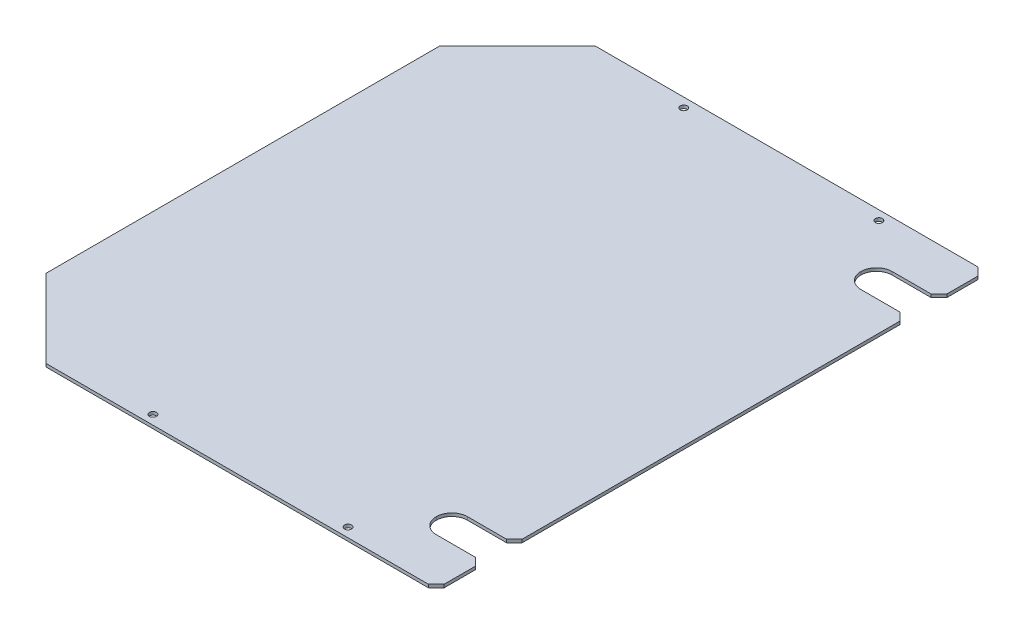
ISO-10303-21;
HEADER;
FILE_DESCRIPTION(('STEP AP214'),'2;1');
FILE_NAME('part.step','',(''),(''),'','','');
FILE_SCHEMA(('AUTOMOTIVE_DESIGN { 1 0 10303 214 1 1 1 1 }'));
ENDSEC;
DATA;
#1=APPLICATION_CONTEXT('core data for automotive mechanical design processes');
#2=APPLICATION_PROTOCOL_DEFINITION('international standard','automotive_design',2000,#1);
#3=PRODUCT_CONTEXT('',#1,'mechanical');
#4=PRODUCT('Part','Part','',(#3));
#5=PRODUCT_RELATED_PRODUCT_CATEGORY('part','',(#4));
#6=PRODUCT_DEFINITION_FORMATION('','',#4);
#7=PRODUCT_DEFINITION_CONTEXT('part definition',#1,'design');
#8=PRODUCT_DEFINITION('design','',#6,#7);
#9=PRODUCT_DEFINITION_SHAPE('','',#8);
#10=(LENGTH_UNIT() NAMED_UNIT(*) SI_UNIT(.MILLI.,.METRE.));
#11=(NAMED_UNIT(*) PLANE_ANGLE_UNIT() SI_UNIT($,.RADIAN.));
#12=(NAMED_UNIT(*) SI_UNIT($,.STERADIAN.) SOLID_ANGLE_UNIT());
#13=UNCERTAINTY_MEASURE_WITH_UNIT(LENGTH_MEASURE(1.E-05),#10,'distance_accuracy_value','');
#14=(GEOMETRIC_REPRESENTATION_CONTEXT(3) GLOBAL_UNCERTAINTY_ASSIGNED_CONTEXT((#13)) GLOBAL_UNIT_ASSIGNED_CONTEXT((#10,
#11,#12)) REPRESENTATION_CONTEXT('',''));
#15=CARTESIAN_POINT('',(0.,0.,0.));
#16=DIRECTION('',(0.,0.,1.));
#17=DIRECTION('',(1.,0.,0.));
#18=AXIS2_PLACEMENT_3D('',#15,#16,#17);
#19=CARTESIAN_POINT('',(150.,0.,352.));
#20=DIRECTION('',(1.,0.,0.));
#21=DIRECTION('',(0.,0.,-1.));
#22=AXIS2_PLACEMENT_3D('',#19,#20,#21);
#23=PLANE('',#22);
#24=DIRECTION('',(0.,0.,-1.));
#25=VECTOR('',#24,1.);
#26=CARTESIAN_POINT('',(150.,-2.,352.));
#27=LINE('',#26,#25);
#28=CARTESIAN_POINT('',(150.,-2.,347.));
#29=VERTEX_POINT('',#28);
#30=CARTESIAN_POINT('',(150.,-2.,327.));
#31=VERTEX_POINT('',#30);
#32=EDGE_CURVE('E213',#29,#31,#27,.T.);
#33=ORIENTED_EDGE('',*,*,#32,.T.);
#34=DIRECTION('',(0.,1.,0.));
#35=VECTOR('',#34,1.);
#36=CARTESIAN_POINT('',(150.,0.,327.));
#37=LINE('',#36,#35);
#38=CARTESIAN_POINT('',(150.,0.,327.));
#39=VERTEX_POINT('',#38);
#40=EDGE_CURVE('E279',#31,#39,#37,.T.);
#41=ORIENTED_EDGE('',*,*,#40,.T.);
#42=DIRECTION('',(0.,0.,-1.));
#43=VECTOR('',#42,1.);
#44=CARTESIAN_POINT('',(150.,0.,352.));
#45=LINE('',#44,#43);
#46=CARTESIAN_POINT('',(150.,0.,347.));
#47=VERTEX_POINT('',#46);
#48=EDGE_CURVE('E375',#47,#39,#45,.T.);
#49=ORIENTED_EDGE('',*,*,#48,.F.);
#50=DIRECTION('',(0.,-1.,0.));
#51=VECTOR('',#50,1.);
#52=CARTESIAN_POINT('',(150.,-2.,347.));
#53=LINE('',#52,#51);
#54=EDGE_CURVE('E207',#47,#29,#53,.T.);
#55=ORIENTED_EDGE('',*,*,#54,.T.);
#56=EDGE_LOOP('',(#33,#41,#49,#55));
#57=FACE_BOUND('',#56,.T.);
#58=ADVANCED_FACE('F34',(#57),#23,.T.);
#59=CARTESIAN_POINT('',(150.,0.,297.));
#60=VERTEX_POINT('',#59);
#61=CARTESIAN_POINT('',(150.,0.,55.0000000000002));
#62=VERTEX_POINT('',#61);
#63=EDGE_CURVE('E376',#60,#62,#45,.T.);
#64=ORIENTED_EDGE('',*,*,#63,.F.);
#65=DIRECTION('',(0.,-1.,0.));
#66=VECTOR('',#65,1.);
#67=CARTESIAN_POINT('',(150.,-2.,297.));
#68=LINE('',#67,#66);
#69=CARTESIAN_POINT('',(150.,-2.,297.));
#70=VERTEX_POINT('',#69);
#71=EDGE_CURVE('E56',#60,#70,#68,.T.);
#72=ORIENTED_EDGE('',*,*,#71,.T.);
#73=CARTESIAN_POINT('',(150.,-2.,55.0000000000002));
#74=VERTEX_POINT('',#73);
#75=EDGE_CURVE('E218',#70,#74,#27,.T.);
#76=ORIENTED_EDGE('',*,*,#75,.T.);
#77=DIRECTION('',(0.,1.,0.));
#78=VECTOR('',#77,1.);
#79=CARTESIAN_POINT('',(150.,0.,55.0000000000001));
#80=LINE('',#79,#78);
#81=EDGE_CURVE('E309',#74,#62,#80,.T.);
#82=ORIENTED_EDGE('',*,*,#81,.T.);
#83=EDGE_LOOP('',(#64,#72,#76,#82));
#84=FACE_BOUND('',#83,.T.);
#85=ADVANCED_FACE('F390',(#84),#23,.T.);
#86=CARTESIAN_POINT('',(-150.,-2.,352.));
#87=DIRECTION('',(0.,1.,0.));
#88=DIRECTION('',(0.,0.,1.));
#89=AXIS2_PLACEMENT_3D('',#86,#87,#88);
#90=PLANE('',#89);
#91=CARTESIAN_POINT('',(-37.4999999999963,-2.,5.99999999999998));
#92=DIRECTION('',(0.,-1.,0.));
#93=DIRECTION('',(0.,0.,-1.));
#94=AXIS2_PLACEMENT_3D('',#91,#92,#93);
#95=CIRCLE('',#94,2.25);
#96=CARTESIAN_POINT('',(-37.4999999999963,-2.,3.74999999999997));
#97=VERTEX_POINT('',#96);
#98=EDGE_CURVE('E342',#97,#97,#95,.T.);
#99=ORIENTED_EDGE('',*,*,#98,.F.);
#100=EDGE_LOOP('',(#99));
#101=FACE_BOUND('',#100,.T.);
#102=CARTESIAN_POINT('',(87.5000000000038,-2.,5.99999999999969));
#103=DIRECTION('',(0.,-1.,0.));
#104=DIRECTION('',(0.,0.,-1.));
#105=AXIS2_PLACEMENT_3D('',#102,#103,#104);
#106=CIRCLE('',#105,2.25);
#107=CARTESIAN_POINT('',(87.5000000000038,-2.,3.74999999999969));
#108=VERTEX_POINT('',#107);
#109=EDGE_CURVE('E349',#108,#108,#106,.T.);
#110=ORIENTED_EDGE('',*,*,#109,.F.);
#111=EDGE_LOOP('',(#110));
#112=FACE_BOUND('',#111,.T.);
#113=CARTESIAN_POINT('',(87.5000000000001,-2.,346.));
#114=DIRECTION('',(0.,-1.,0.));
#115=DIRECTION('',(0.,0.,-1.));
#116=AXIS2_PLACEMENT_3D('',#113,#114,#115);
#117=CIRCLE('',#116,2.24999999999998);
#118=CARTESIAN_POINT('',(87.5000000000001,-2.,343.75));
#119=VERTEX_POINT('',#118);
#120=EDGE_CURVE('E355',#119,#119,#117,.T.);
#121=ORIENTED_EDGE('',*,*,#120,.F.);
#122=EDGE_LOOP('',(#121));
#123=FACE_BOUND('',#122,.T.);
#124=CARTESIAN_POINT('',(-37.5,-2.,346.));
#125=DIRECTION('',(0.,-1.,0.));
#126=DIRECTION('',(0.,0.,-1.));
#127=AXIS2_PLACEMENT_3D('',#124,#125,#126);
#128=CIRCLE('',#127,2.24999999999999);
#129=CARTESIAN_POINT('',(-37.5,-2.,343.75));
#130=VERTEX_POINT('',#129);
#131=EDGE_CURVE('E198',#130,#130,#128,.T.);
#132=ORIENTED_EDGE('',*,*,#131,.F.);
#133=EDGE_LOOP('',(#132));
#134=FACE_BOUND('',#133,.T.);
#135=DIRECTION('',(1.,0.,0.));
#136=VECTOR('',#135,1.);
#137=CARTESIAN_POINT('',(150.,-2.,322.));
#138=LINE('',#137,#136);
#139=CARTESIAN_POINT('',(120.,-2.,322.));
#140=VERTEX_POINT('',#139);
#141=CARTESIAN_POINT('',(145.,-2.,322.));
#142=VERTEX_POINT('',#141);
#143=EDGE_CURVE('E336',#140,#142,#138,.T.);
#144=ORIENTED_EDGE('',*,*,#143,.T.);
#145=DIRECTION('',(0.707106781186544,0.,0.707106781186551));
#146=VECTOR('',#145,1.);
#147=CARTESIAN_POINT('',(150.,-2.,327.));
#148=LINE('',#147,#146);
#149=EDGE_CURVE('E304',#142,#31,#148,.T.);
#150=ORIENTED_EDGE('',*,*,#149,.T.);
#151=ORIENTED_EDGE('',*,*,#32,.F.);
#152=DIRECTION('',(-0.707106781186544,0.,0.707106781186551));
#153=VECTOR('',#152,1.);
#154=CARTESIAN_POINT('',(150.,-2.,347.));
#155=LINE('',#154,#153);
#156=CARTESIAN_POINT('',(145.,-2.,352.));
#157=VERTEX_POINT('',#156);
#158=EDGE_CURVE('E208',#29,#157,#155,.T.);
#159=ORIENTED_EDGE('',*,*,#158,.T.);
#160=DIRECTION('',(1.,0.,0.));
#161=VECTOR('',#160,1.);
#162=CARTESIAN_POINT('',(-150.,-2.,352.));
#163=LINE('',#162,#161);
#164=CARTESIAN_POINT('',(-99.9999999999997,-2.,352.));
#165=VERTEX_POINT('',#164);
#166=EDGE_CURVE('E365',#165,#157,#163,.T.);
#167=ORIENTED_EDGE('',*,*,#166,.F.);
#168=DIRECTION('',(-0.707106781186548,0.,-0.707106781186547));
#169=VECTOR('',#168,1.);
#170=CARTESIAN_POINT('',(-150.,-2.,302.));
#171=LINE('',#170,#169);
#172=CARTESIAN_POINT('',(-150.,-2.,302.));
#173=VERTEX_POINT('',#172);
#174=EDGE_CURVE('E245',#165,#173,#171,.T.);
#175=ORIENTED_EDGE('',*,*,#174,.T.);
#176=DIRECTION('',(0.,0.,-1.));
#177=VECTOR('',#176,1.);
#178=CARTESIAN_POINT('',(-150.,-2.,352.));
#179=LINE('',#178,#177);
#180=CARTESIAN_POINT('',(-150.,-2.,50.0000000000003));
#181=VERTEX_POINT('',#180);
#182=EDGE_CURVE('E368',#173,#181,#179,.T.);
#183=ORIENTED_EDGE('',*,*,#182,.T.);
#184=DIRECTION('',(-0.707106781186547,0.,0.707106781186548));
#185=VECTOR('',#184,1.);
#186=CARTESIAN_POINT('',(-99.9999999999999,-2.,0.));
#187=LINE('',#186,#185);
#188=CARTESIAN_POINT('',(-99.9999999999999,-2.,0.));
#189=VERTEX_POINT('',#188);
#190=EDGE_CURVE('E192',#181,#189,#187,.F.);
#191=ORIENTED_EDGE('',*,*,#190,.T.);
#192=DIRECTION('',(1.,0.,0.));
#193=VECTOR('',#192,1.);
#194=CARTESIAN_POINT('',(-150.,-2.,0.));
#195=LINE('',#194,#193);
#196=CARTESIAN_POINT('',(145.,-2.,0.));
#197=VERTEX_POINT('',#196);
#198=EDGE_CURVE('E183',#189,#197,#195,.T.);
#199=ORIENTED_EDGE('',*,*,#198,.T.);
#200=DIRECTION('',(-0.707106781186548,0.,-0.707106781186548));
#201=VECTOR('',#200,1.);
#202=CARTESIAN_POINT('',(145.,-2.,0.));
#203=LINE('',#202,#201);
#204=CARTESIAN_POINT('',(150.,-2.,5.));
#205=VERTEX_POINT('',#204);
#206=EDGE_CURVE('E188',#197,#205,#203,.F.);
#207=ORIENTED_EDGE('',*,*,#206,.T.);
#208=CARTESIAN_POINT('',(150.,-2.,25.0000000000001));
#209=VERTEX_POINT('',#208);
#210=EDGE_CURVE('E220',#209,#205,#27,.T.);
#211=ORIENTED_EDGE('',*,*,#210,.F.);
#212=DIRECTION('',(-0.707106781186546,0.,0.707106781186549));
#213=VECTOR('',#212,1.);
#214=CARTESIAN_POINT('',(145.,-2.,30.0000000000001));
#215=LINE('',#214,#213);
#216=CARTESIAN_POINT('',(145.,-2.,30.0000000000001));
#217=VERTEX_POINT('',#216);
#218=EDGE_CURVE('E299',#209,#217,#215,.T.);
#219=ORIENTED_EDGE('',*,*,#218,.T.);
#220=DIRECTION('',(-1.,0.,0.));
#221=VECTOR('',#220,1.);
#222=CARTESIAN_POINT('',(150.,-2.,30.0000000000001));
#223=LINE('',#222,#221);
#224=CARTESIAN_POINT('',(120.,-2.,30.0000000000001));
#225=VERTEX_POINT('',#224);
#226=EDGE_CURVE('E321',#217,#225,#223,.T.);
#227=ORIENTED_EDGE('',*,*,#226,.T.);
#228=CARTESIAN_POINT('',(120.,-2.,40.0000000000001));
#229=DIRECTION('',(0.,1.,0.));
#230=DIRECTION('',(0.,0.,1.));
#231=AXIS2_PLACEMENT_3D('',#228,#229,#230);
#232=CIRCLE('',#231,10.);
#233=CARTESIAN_POINT('',(110.,-2.,40.0000000000001));
#234=VERTEX_POINT('',#233);
#235=EDGE_CURVE('E277',#225,#234,#232,.T.);
#236=ORIENTED_EDGE('',*,*,#235,.T.);
#237=CARTESIAN_POINT('',(120.,-2.,40.0000000000001));
#238=DIRECTION('',(0.,1.,0.));
#239=DIRECTION('',(0.,0.,1.));
#240=AXIS2_PLACEMENT_3D('',#237,#238,#239);
#241=CIRCLE('',#240,10.);
#242=CARTESIAN_POINT('',(120.,-2.,50.0000000000001));
#243=VERTEX_POINT('',#242);
#244=EDGE_CURVE('E272',#234,#243,#241,.T.);
#245=ORIENTED_EDGE('',*,*,#244,.T.);
#246=DIRECTION('',(1.,0.,0.));
#247=VECTOR('',#246,1.);
#248=CARTESIAN_POINT('',(150.,-2.,50.0000000000001));
#249=LINE('',#248,#247);
#250=CARTESIAN_POINT('',(145.,-2.,50.0000000000001));
#251=VERTEX_POINT('',#250);
#252=EDGE_CURVE('E339',#243,#251,#249,.T.);
#253=ORIENTED_EDGE('',*,*,#252,.T.);
#254=DIRECTION('',(0.707106781186548,0.,0.707106781186548));
#255=VECTOR('',#254,1.);
#256=CARTESIAN_POINT('',(150.,-2.,55.0000000000001));
#257=LINE('',#256,#255);
#258=EDGE_CURVE('E49',#251,#74,#257,.T.);
#259=ORIENTED_EDGE('',*,*,#258,.T.);
#260=ORIENTED_EDGE('',*,*,#75,.F.);
#261=DIRECTION('',(-0.707106781186548,0.,0.707106781186548));
#262=VECTOR('',#261,1.);
#263=CARTESIAN_POINT('',(145.,-2.,302.));
#264=LINE('',#263,#262);
#265=CARTESIAN_POINT('',(145.,-2.,302.));
#266=VERTEX_POINT('',#265);
#267=EDGE_CURVE('E302',#70,#266,#264,.T.);
#268=ORIENTED_EDGE('',*,*,#267,.T.);
#269=DIRECTION('',(-1.,0.,0.));
#270=VECTOR('',#269,1.);
#271=CARTESIAN_POINT('',(150.,-2.,302.));
#272=LINE('',#271,#270);
#273=CARTESIAN_POINT('',(120.,-2.,302.));
#274=VERTEX_POINT('',#273);
#275=EDGE_CURVE('E332',#266,#274,#272,.T.);
#276=ORIENTED_EDGE('',*,*,#275,.T.);
#277=CARTESIAN_POINT('',(120.,-2.,312.));
#278=DIRECTION('',(0.,1.,0.));
#279=DIRECTION('',(0.,0.,1.));
#280=AXIS2_PLACEMENT_3D('',#277,#278,#279);
#281=CIRCLE('',#280,10.);
#282=CARTESIAN_POINT('',(110.,-2.,312.));
#283=VERTEX_POINT('',#282);
#284=EDGE_CURVE('E268',#274,#283,#281,.T.);
#285=ORIENTED_EDGE('',*,*,#284,.T.);
#286=CARTESIAN_POINT('',(120.,-2.,312.));
#287=DIRECTION('',(0.,1.,0.));
#288=DIRECTION('',(0.,0.,1.));
#289=AXIS2_PLACEMENT_3D('',#286,#287,#288);
#290=CIRCLE('',#289,10.);
#291=EDGE_CURVE('E263',#283,#140,#290,.T.);
#292=ORIENTED_EDGE('',*,*,#291,.T.);
#293=EDGE_LOOP('',(#144,#150,#151,#159,#167,#175,#183,#191,#199,#207,#211,#219,#227,#236,#245,
#253,#259,#260,#268,#276,#285,#292));
#294=FACE_BOUND('',#293,.T.);
#295=ADVANCED_FACE('F186',(#101,#112,#123,#134,#294),#90,.F.);
#296=CARTESIAN_POINT('',(150.,0.,25.));
#297=VERTEX_POINT('',#296);
#298=CARTESIAN_POINT('',(150.,0.,5.00000000000014));
#299=VERTEX_POINT('',#298);
#300=EDGE_CURVE('E374',#297,#299,#45,.T.);
#301=ORIENTED_EDGE('',*,*,#300,.F.);
#302=DIRECTION('',(0.,-1.,0.));
#303=VECTOR('',#302,1.);
#304=CARTESIAN_POINT('',(150.,-2.,25.));
#305=LINE('',#304,#303);
#306=EDGE_CURVE('E11',#297,#209,#305,.T.);
#307=ORIENTED_EDGE('',*,*,#306,.T.);
#308=ORIENTED_EDGE('',*,*,#210,.T.);
#309=DIRECTION('',(0.,1.,0.));
#310=VECTOR('',#309,1.);
#311=CARTESIAN_POINT('',(150.,0.,5.));
#312=LINE('',#311,#310);
#313=EDGE_CURVE('E206',#205,#299,#312,.T.);
#314=ORIENTED_EDGE('',*,*,#313,.T.);
#315=EDGE_LOOP('',(#301,#307,#308,#314));
#316=FACE_BOUND('',#315,.T.);
#317=ADVANCED_FACE('F381',(#316),#23,.T.);
#318=CARTESIAN_POINT('',(-150.,0.,352.));
#319=DIRECTION('',(0.,1.,0.));
#320=DIRECTION('',(0.,0.,1.));
#321=AXIS2_PLACEMENT_3D('',#318,#319,#320);
#322=PLANE('',#321);
#323=ORIENTED_EDGE('',*,*,#48,.T.);
#324=DIRECTION('',(-0.707106781186544,0.,-0.707106781186551));
#325=VECTOR('',#324,1.);
#326=CARTESIAN_POINT('',(12.5000000000016,0.,189.5));
#327=LINE('',#326,#325);
#328=CARTESIAN_POINT('',(145.,0.,322.));
#329=VERTEX_POINT('',#328);
#330=EDGE_CURVE('E295',#39,#329,#327,.T.);
#331=ORIENTED_EDGE('',*,*,#330,.T.);
#332=DIRECTION('',(1.,0.,0.));
#333=VECTOR('',#332,1.);
#334=CARTESIAN_POINT('',(150.,0.,322.));
#335=LINE('',#334,#333);
#336=CARTESIAN_POINT('',(120.,0.,322.));
#337=VERTEX_POINT('',#336);
#338=EDGE_CURVE('E283',#337,#329,#335,.T.);
#339=ORIENTED_EDGE('',*,*,#338,.F.);
#340=CARTESIAN_POINT('',(120.,0.,312.));
#341=DIRECTION('',(0.,1.,0.));
#342=DIRECTION('',(0.,0.,1.));
#343=AXIS2_PLACEMENT_3D('',#340,#341,#342);
#344=CIRCLE('',#343,10.);
#345=CARTESIAN_POINT('',(110.,0.,312.));
#346=VERTEX_POINT('',#345);
#347=EDGE_CURVE('E261',#337,#346,#344,.F.);
#348=ORIENTED_EDGE('',*,*,#347,.T.);
#349=CARTESIAN_POINT('',(120.,0.,312.));
#350=DIRECTION('',(0.,1.,0.));
#351=DIRECTION('',(0.,0.,1.));
#352=AXIS2_PLACEMENT_3D('',#349,#350,#351);
#353=CIRCLE('',#352,10.);
#354=CARTESIAN_POINT('',(120.,0.,302.));
#355=VERTEX_POINT('',#354);
#356=EDGE_CURVE('E265',#346,#355,#353,.F.);
#357=ORIENTED_EDGE('',*,*,#356,.T.);
#358=DIRECTION('',(-1.,0.,0.));
#359=VECTOR('',#358,1.);
#360=CARTESIAN_POINT('',(150.,0.,302.));
#361=LINE('',#360,#359);
#362=CARTESIAN_POINT('',(145.,0.,302.));
#363=VERTEX_POINT('',#362);
#364=EDGE_CURVE('E457',#363,#355,#361,.T.);
#365=ORIENTED_EDGE('',*,*,#364,.F.);
#366=DIRECTION('',(0.707106781186548,0.,-0.707106781186548));
#367=VECTOR('',#366,1.);
#368=CARTESIAN_POINT('',(-27.5,0.,474.5));
#369=LINE('',#368,#367);
#370=EDGE_CURVE('E293',#363,#60,#369,.T.);
#371=ORIENTED_EDGE('',*,*,#370,.T.);
#372=ORIENTED_EDGE('',*,*,#63,.T.);
#373=DIRECTION('',(-0.707106781186548,0.,-0.707106781186548));
#374=VECTOR('',#373,1.);
#375=CARTESIAN_POINT('',(148.5,0.,53.5));
#376=LINE('',#375,#374);
#377=CARTESIAN_POINT('',(145.,0.,50.0000000000001));
#378=VERTEX_POINT('',#377);
#379=EDGE_CURVE('E291',#62,#378,#376,.T.);
#380=ORIENTED_EDGE('',*,*,#379,.T.);
#381=DIRECTION('',(1.,0.,0.));
#382=VECTOR('',#381,1.);
#383=CARTESIAN_POINT('',(150.,0.,50.0000000000001));
#384=LINE('',#383,#382);
#385=CARTESIAN_POINT('',(120.,0.,50.0000000000001));
#386=VERTEX_POINT('',#385);
#387=EDGE_CURVE('E331',#386,#378,#384,.T.);
#388=ORIENTED_EDGE('',*,*,#387,.F.);
#389=CARTESIAN_POINT('',(120.,0.,40.0000000000001));
#390=DIRECTION('',(0.,1.,0.));
#391=DIRECTION('',(0.,0.,1.));
#392=AXIS2_PLACEMENT_3D('',#389,#390,#391);
#393=CIRCLE('',#392,10.);
#394=CARTESIAN_POINT('',(110.,0.,40.0000000000001));
#395=VERTEX_POINT('',#394);
#396=EDGE_CURVE('E270',#386,#395,#393,.F.);
#397=ORIENTED_EDGE('',*,*,#396,.T.);
#398=CARTESIAN_POINT('',(120.,0.,40.0000000000001));
#399=DIRECTION('',(0.,1.,0.));
#400=DIRECTION('',(0.,0.,1.));
#401=AXIS2_PLACEMENT_3D('',#398,#399,#400);
#402=CIRCLE('',#401,10.);
#403=CARTESIAN_POINT('',(120.,0.,30.0000000000001));
#404=VERTEX_POINT('',#403);
#405=EDGE_CURVE('E274',#395,#404,#402,.F.);
#406=ORIENTED_EDGE('',*,*,#405,.T.);
#407=DIRECTION('',(-1.,0.,0.));
#408=VECTOR('',#407,1.);
#409=CARTESIAN_POINT('',(150.,0.,30.0000000000001));
#410=LINE('',#409,#408);
#411=CARTESIAN_POINT('',(145.,0.,30.));
#412=VERTEX_POINT('',#411);
#413=EDGE_CURVE('E320',#412,#404,#410,.T.);
#414=ORIENTED_EDGE('',*,*,#413,.F.);
#415=DIRECTION('',(0.707106781186546,0.,-0.707106781186549));
#416=VECTOR('',#415,1.);
#417=CARTESIAN_POINT('',(-163.499999999999,0.,338.500000000001));
#418=LINE('',#417,#416);
#419=EDGE_CURVE('E289',#412,#297,#418,.T.);
#420=ORIENTED_EDGE('',*,*,#419,.T.);
#421=ORIENTED_EDGE('',*,*,#300,.T.);
#422=DIRECTION('',(0.707106781186548,0.,0.707106781186548));
#423=VECTOR('',#422,1.);
#424=CARTESIAN_POINT('',(173.5,0.,28.5));
#425=LINE('',#424,#423);
#426=CARTESIAN_POINT('',(145.,0.,0.));
#427=VERTEX_POINT('',#426);
#428=EDGE_CURVE('E228',#299,#427,#425,.F.);
#429=ORIENTED_EDGE('',*,*,#428,.T.);
#430=DIRECTION('',(1.,0.,0.));
#431=VECTOR('',#430,1.);
#432=CARTESIAN_POINT('',(-150.,0.,0.));
#433=LINE('',#432,#431);
#434=CARTESIAN_POINT('',(-99.9999999999999,0.,0.));
#435=VERTEX_POINT('',#434);
#436=EDGE_CURVE('E197',#435,#427,#433,.T.);
#437=ORIENTED_EDGE('',*,*,#436,.F.);
#438=DIRECTION('',(0.707106781186547,0.,-0.707106781186548));
#439=VECTOR('',#438,1.);
#440=CARTESIAN_POINT('',(-301.,0.,201.));
#441=LINE('',#440,#439);
#442=CARTESIAN_POINT('',(-150.,0.,50.0000000000002));
#443=VERTEX_POINT('',#442);
#444=EDGE_CURVE('E238',#435,#443,#441,.F.);
#445=ORIENTED_EDGE('',*,*,#444,.T.);
#446=DIRECTION('',(0.,0.,-1.));
#447=VECTOR('',#446,1.);
#448=CARTESIAN_POINT('',(-150.,0.,352.));
#449=LINE('',#448,#447);
#450=CARTESIAN_POINT('',(-150.,0.,302.));
#451=VERTEX_POINT('',#450);
#452=EDGE_CURVE('E372',#451,#443,#449,.T.);
#453=ORIENTED_EDGE('',*,*,#452,.F.);
#454=DIRECTION('',(0.707106781186548,0.,0.707106781186547));
#455=VECTOR('',#454,1.);
#456=CARTESIAN_POINT('',(-125.,0.,327.));
#457=LINE('',#456,#455);
#458=CARTESIAN_POINT('',(-99.9999999999997,0.,352.));
#459=VERTEX_POINT('',#458);
#460=EDGE_CURVE('E240',#451,#459,#457,.T.);
#461=ORIENTED_EDGE('',*,*,#460,.T.);
#462=DIRECTION('',(1.,0.,0.));
#463=VECTOR('',#462,1.);
#464=CARTESIAN_POINT('',(-150.,0.,352.));
#465=LINE('',#464,#463);
#466=CARTESIAN_POINT('',(145.,0.,352.));
#467=VERTEX_POINT('',#466);
#468=EDGE_CURVE('E367',#459,#467,#465,.T.);
#469=ORIENTED_EDGE('',*,*,#468,.T.);
#470=DIRECTION('',(0.707106781186544,0.,-0.707106781186551));
#471=VECTOR('',#470,1.);
#472=CARTESIAN_POINT('',(-2.49999999999834,0.,499.5));
#473=LINE('',#472,#471);
#474=EDGE_CURVE('E226',#467,#47,#473,.T.);
#475=ORIENTED_EDGE('',*,*,#474,.T.);
#476=EDGE_LOOP('',(#323,#331,#339,#348,#357,#365,#371,#372,#380,#388,#397,#406,#414,#420,#421,
#429,#437,#445,#453,#461,#469,#475));
#477=FACE_BOUND('',#476,.T.);
#478=CARTESIAN_POINT('',(-37.4999999999963,0.,5.99999999999998));
#479=DIRECTION('',(0.,1.,0.));
#480=DIRECTION('',(0.,0.,1.));
#481=AXIS2_PLACEMENT_3D('',#478,#479,#480);
#482=CIRCLE('',#481,2.25);
#483=CARTESIAN_POINT('',(-37.4999999999963,0.,8.24999999999998));
#484=VERTEX_POINT('',#483);
#485=EDGE_CURVE('E346',#484,#484,#482,.F.);
#486=ORIENTED_EDGE('',*,*,#485,.T.);
#487=EDGE_LOOP('',(#486));
#488=FACE_BOUND('',#487,.T.);
#489=CARTESIAN_POINT('',(87.5000000000038,0.,5.99999999999969));
#490=DIRECTION('',(0.,1.,0.));
#491=DIRECTION('',(0.,0.,1.));
#492=AXIS2_PLACEMENT_3D('',#489,#490,#491);
#493=CIRCLE('',#492,2.25);
#494=CARTESIAN_POINT('',(87.5000000000038,0.,8.24999999999968));
#495=VERTEX_POINT('',#494);
#496=EDGE_CURVE('E345',#495,#495,#493,.F.);
#497=ORIENTED_EDGE('',*,*,#496,.T.);
#498=EDGE_LOOP('',(#497));
#499=FACE_BOUND('',#498,.T.);
#500=CARTESIAN_POINT('',(87.5000000000001,0.,346.));
#501=DIRECTION('',(0.,1.,0.));
#502=DIRECTION('',(0.,0.,1.));
#503=AXIS2_PLACEMENT_3D('',#500,#501,#502);
#504=CIRCLE('',#503,2.24999999999998);
#505=CARTESIAN_POINT('',(87.5000000000001,0.,348.25));
#506=VERTEX_POINT('',#505);
#507=EDGE_CURVE('E352',#506,#506,#504,.F.);
#508=ORIENTED_EDGE('',*,*,#507,.T.);
#509=EDGE_LOOP('',(#508));
#510=FACE_BOUND('',#509,.T.);
#511=CARTESIAN_POINT('',(-37.5,0.,346.));
#512=DIRECTION('',(0.,1.,0.));
#513=DIRECTION('',(0.,0.,1.));
#514=AXIS2_PLACEMENT_3D('',#511,#512,#513);
#515=CIRCLE('',#514,2.24999999999999);
#516=CARTESIAN_POINT('',(-37.5,0.,348.25));
#517=VERTEX_POINT('',#516);
#518=EDGE_CURVE('E358',#517,#517,#515,.F.);
#519=ORIENTED_EDGE('',*,*,#518,.T.);
#520=EDGE_LOOP('',(#519));
#521=FACE_BOUND('',#520,.T.);
#522=ADVANCED_FACE('F326',(#477,#488,#499,#510,#521),#322,.T.);
#523=CARTESIAN_POINT('',(-150.,-2.,352.));
#524=DIRECTION('',(-1.,0.,0.));
#525=DIRECTION('',(0.,0.,1.));
#526=AXIS2_PLACEMENT_3D('',#523,#524,#525);
#527=PLANE('',#526);
#528=ORIENTED_EDGE('',*,*,#182,.F.);
#529=DIRECTION('',(0.,1.,0.));
#530=VECTOR('',#529,1.);
#531=CARTESIAN_POINT('',(-150.,0.,302.));
#532=LINE('',#531,#530);
#533=EDGE_CURVE('E235',#173,#451,#532,.T.);
#534=ORIENTED_EDGE('',*,*,#533,.T.);
#535=ORIENTED_EDGE('',*,*,#452,.T.);
#536=DIRECTION('',(0.,-1.,0.));
#537=VECTOR('',#536,1.);
#538=CARTESIAN_POINT('',(-150.,-2.,50.0000000000002));
#539=LINE('',#538,#537);
#540=EDGE_CURVE('E233',#443,#181,#539,.T.);
#541=ORIENTED_EDGE('',*,*,#540,.T.);
#542=EDGE_LOOP('',(#528,#534,#535,#541));
#543=FACE_BOUND('',#542,.T.);
#544=ADVANCED_FACE('F403',(#543),#527,.T.);
#545=CARTESIAN_POINT('',(150.,-2.,352.));
#546=DIRECTION('',(0.,0.,-1.));
#547=DIRECTION('',(-1.,0.,0.));
#548=AXIS2_PLACEMENT_3D('',#545,#546,#547);
#549=PLANE('',#548);
#550=ORIENTED_EDGE('',*,*,#468,.F.);
#551=DIRECTION('',(0.,-1.,0.));
#552=VECTOR('',#551,1.);
#553=CARTESIAN_POINT('',(-99.9999999999997,-2.,352.));
#554=LINE('',#553,#552);
#555=EDGE_CURVE('E242',#459,#165,#554,.T.);
#556=ORIENTED_EDGE('',*,*,#555,.T.);
#557=ORIENTED_EDGE('',*,*,#166,.T.);
#558=DIRECTION('',(0.,1.,0.));
#559=VECTOR('',#558,1.);
#560=CARTESIAN_POINT('',(145.,0.,352.));
#561=LINE('',#560,#559);
#562=EDGE_CURVE('E230',#157,#467,#561,.T.);
#563=ORIENTED_EDGE('',*,*,#562,.T.);
#564=EDGE_LOOP('',(#550,#556,#557,#563));
#565=FACE_BOUND('',#564,.T.);
#566=ADVANCED_FACE('F506',(#565),#549,.F.);
#567=CARTESIAN_POINT('',(150.,-2.,0.));
#568=DIRECTION('',(0.,0.,-1.));
#569=DIRECTION('',(-1.,0.,0.));
#570=AXIS2_PLACEMENT_3D('',#567,#568,#569);
#571=PLANE('',#570);
#572=ORIENTED_EDGE('',*,*,#198,.F.);
#573=DIRECTION('',(0.,1.,0.));
#574=VECTOR('',#573,1.);
#575=CARTESIAN_POINT('',(-99.9999999999999,-2.,0.));
#576=LINE('',#575,#574);
#577=EDGE_CURVE('E247',#189,#435,#576,.T.);
#578=ORIENTED_EDGE('',*,*,#577,.T.);
#579=ORIENTED_EDGE('',*,*,#436,.T.);
#580=DIRECTION('',(0.,-1.,0.));
#581=VECTOR('',#580,1.);
#582=CARTESIAN_POINT('',(145.,-2.,0.));
#583=LINE('',#582,#581);
#584=EDGE_CURVE('E204',#427,#197,#583,.T.);
#585=ORIENTED_EDGE('',*,*,#584,.T.);
#586=EDGE_LOOP('',(#572,#578,#579,#585));
#587=FACE_BOUND('',#586,.T.);
#588=ADVANCED_FACE('F210',(#587),#571,.T.);
#589=CARTESIAN_POINT('',(145.,-2.,0.));
#590=DIRECTION('',(-0.707106781186547,0.,0.707106781186547));
#591=DIRECTION('',(0.707106781186548,0.,0.707106781186548));
#592=AXIS2_PLACEMENT_3D('',#589,#590,#591);
#593=PLANE('',#592);
#594=ORIENTED_EDGE('',*,*,#428,.F.);
#595=ORIENTED_EDGE('',*,*,#313,.F.);
#596=ORIENTED_EDGE('',*,*,#206,.F.);
#597=ORIENTED_EDGE('',*,*,#584,.F.);
#598=EDGE_LOOP('',(#594,#595,#596,#597));
#599=FACE_BOUND('',#598,.T.);
#600=ADVANCED_FACE('F203',(#599),#593,.F.);
#601=CARTESIAN_POINT('',(150.,0.,347.));
#602=DIRECTION('',(0.707106781186551,0.,0.707106781186544));
#603=DIRECTION('',(0.707106781186544,0.,-0.707106781186551));
#604=AXIS2_PLACEMENT_3D('',#601,#602,#603);
#605=PLANE('',#604);
#606=ORIENTED_EDGE('',*,*,#474,.F.);
#607=ORIENTED_EDGE('',*,*,#562,.F.);
#608=ORIENTED_EDGE('',*,*,#158,.F.);
#609=ORIENTED_EDGE('',*,*,#54,.F.);
#610=EDGE_LOOP('',(#606,#607,#608,#609));
#611=FACE_BOUND('',#610,.T.);
#612=ADVANCED_FACE('F412',(#611),#605,.T.);
#613=CARTESIAN_POINT('',(-150.,-2.,302.));
#614=DIRECTION('',(-0.707106781186547,0.,0.707106781186548));
#615=DIRECTION('',(0.707106781186548,0.,0.707106781186547));
#616=AXIS2_PLACEMENT_3D('',#613,#614,#615);
#617=PLANE('',#616);
#618=ORIENTED_EDGE('',*,*,#174,.F.);
#619=ORIENTED_EDGE('',*,*,#555,.F.);
#620=ORIENTED_EDGE('',*,*,#460,.F.);
#621=ORIENTED_EDGE('',*,*,#533,.F.);
#622=EDGE_LOOP('',(#618,#619,#620,#621));
#623=FACE_BOUND('',#622,.T.);
#624=ADVANCED_FACE('F415',(#623),#617,.T.);
#625=CARTESIAN_POINT('',(-99.9999999999999,-2.,0.));
#626=DIRECTION('',(0.707106781186548,0.,0.707106781186547));
#627=DIRECTION('',(0.707106781186547,0.,-0.707106781186548));
#628=AXIS2_PLACEMENT_3D('',#625,#626,#627);
#629=PLANE('',#628);
#630=ORIENTED_EDGE('',*,*,#190,.F.);
#631=ORIENTED_EDGE('',*,*,#540,.F.);
#632=ORIENTED_EDGE('',*,*,#444,.F.);
#633=ORIENTED_EDGE('',*,*,#577,.F.);
#634=EDGE_LOOP('',(#630,#631,#632,#633));
#635=FACE_BOUND('',#634,.T.);
#636=ADVANCED_FACE('F419',(#635),#629,.F.);
#637=CARTESIAN_POINT('',(-37.5,0.00100000000000013,346.));
#638=DIRECTION('',(0.,-1.,0.));
#639=DIRECTION('',(0.,0.,-1.));
#640=AXIS2_PLACEMENT_3D('',#637,#638,#639);
#641=CYLINDRICAL_SURFACE('',#640,2.24999999999999);
#642=ORIENTED_EDGE('',*,*,#518,.F.);
#643=EDGE_LOOP('',(#642));
#644=FACE_BOUND('',#643,.T.);
#645=ORIENTED_EDGE('',*,*,#131,.T.);
#646=EDGE_LOOP('',(#645));
#647=FACE_BOUND('',#646,.T.);
#648=ADVANCED_FACE('F423',(#644,#647),#641,.F.);
#649=CARTESIAN_POINT('',(87.5000000000001,0.00100000000000013,346.));
#650=DIRECTION('',(0.,-1.,0.));
#651=DIRECTION('',(0.,0.,-1.));
#652=AXIS2_PLACEMENT_3D('',#649,#650,#651);
#653=CYLINDRICAL_SURFACE('',#652,2.24999999999998);
#654=ORIENTED_EDGE('',*,*,#507,.F.);
#655=EDGE_LOOP('',(#654));
#656=FACE_BOUND('',#655,.T.);
#657=ORIENTED_EDGE('',*,*,#120,.T.);
#658=EDGE_LOOP('',(#657));
#659=FACE_BOUND('',#658,.T.);
#660=ADVANCED_FACE('F498',(#656,#659),#653,.F.);
#661=CARTESIAN_POINT('',(87.5000000000038,0.00100000000000013,5.99999999999969));
#662=DIRECTION('',(0.,-1.,0.));
#663=DIRECTION('',(0.,0.,-1.));
#664=AXIS2_PLACEMENT_3D('',#661,#662,#663);
#665=CYLINDRICAL_SURFACE('',#664,2.25);
#666=ORIENTED_EDGE('',*,*,#496,.F.);
#667=EDGE_LOOP('',(#666));
#668=FACE_BOUND('',#667,.T.);
#669=ORIENTED_EDGE('',*,*,#109,.T.);
#670=EDGE_LOOP('',(#669));
#671=FACE_BOUND('',#670,.T.);
#672=ADVANCED_FACE('F490',(#668,#671),#665,.F.);
#673=CARTESIAN_POINT('',(-37.4999999999963,0.00100000000000013,5.99999999999998));
#674=DIRECTION('',(0.,-1.,0.));
#675=DIRECTION('',(0.,0.,-1.));
#676=AXIS2_PLACEMENT_3D('',#673,#674,#675);
#677=CYLINDRICAL_SURFACE('',#676,2.25);
#678=ORIENTED_EDGE('',*,*,#485,.F.);
#679=EDGE_LOOP('',(#678));
#680=FACE_BOUND('',#679,.T.);
#681=ORIENTED_EDGE('',*,*,#98,.T.);
#682=EDGE_LOOP('',(#681));
#683=FACE_BOUND('',#682,.T.);
#684=ADVANCED_FACE('F483',(#680,#683),#677,.F.);
#685=CARTESIAN_POINT('',(150.,-2.,50.0000000000001));
#686=DIRECTION('',(0.,0.,1.));
#687=DIRECTION('',(1.,0.,0.));
#688=AXIS2_PLACEMENT_3D('',#685,#686,#687);
#689=PLANE('',#688);
#690=ORIENTED_EDGE('',*,*,#387,.T.);
#691=DIRECTION('',(0.,-1.,0.));
#692=VECTOR('',#691,1.);
#693=CARTESIAN_POINT('',(145.,-2.,50.0000000000001));
#694=LINE('',#693,#692);
#695=EDGE_CURVE('E313',#378,#251,#694,.T.);
#696=ORIENTED_EDGE('',*,*,#695,.T.);
#697=ORIENTED_EDGE('',*,*,#252,.F.);
#698=DIRECTION('',(0.,1.,0.));
#699=VECTOR('',#698,1.);
#700=CARTESIAN_POINT('',(120.,0.,50.0000000000001));
#701=LINE('',#700,#699);
#702=EDGE_CURVE('E255',#243,#386,#701,.T.);
#703=ORIENTED_EDGE('',*,*,#702,.T.);
#704=EDGE_LOOP('',(#690,#696,#697,#703));
#705=FACE_BOUND('',#704,.T.);
#706=ADVANCED_FACE('F479',(#705),#689,.F.);
#707=CARTESIAN_POINT('',(150.,-2.,30.0000000000001));
#708=DIRECTION('',(0.,0.,-1.));
#709=DIRECTION('',(-1.,0.,0.));
#710=AXIS2_PLACEMENT_3D('',#707,#708,#709);
#711=PLANE('',#710);
#712=ORIENTED_EDGE('',*,*,#226,.F.);
#713=DIRECTION('',(0.,1.,0.));
#714=VECTOR('',#713,1.);
#715=CARTESIAN_POINT('',(145.,0.,30.0000000000001));
#716=LINE('',#715,#714);
#717=EDGE_CURVE('E42',#217,#412,#716,.T.);
#718=ORIENTED_EDGE('',*,*,#717,.T.);
#719=ORIENTED_EDGE('',*,*,#413,.T.);
#720=DIRECTION('',(0.,1.,0.));
#721=VECTOR('',#720,1.);
#722=CARTESIAN_POINT('',(120.,-2.,30.0000000000001));
#723=LINE('',#722,#721);
#724=EDGE_CURVE('E258',#404,#225,#723,.F.);
#725=ORIENTED_EDGE('',*,*,#724,.T.);
#726=EDGE_LOOP('',(#712,#718,#719,#725));
#727=FACE_BOUND('',#726,.T.);
#728=ADVANCED_FACE('F319',(#727),#711,.F.);
#729=CARTESIAN_POINT('',(150.,-2.,322.));
#730=DIRECTION('',(0.,0.,1.));
#731=DIRECTION('',(1.,0.,0.));
#732=AXIS2_PLACEMENT_3D('',#729,#730,#731);
#733=PLANE('',#732);
#734=ORIENTED_EDGE('',*,*,#338,.T.);
#735=DIRECTION('',(0.,-1.,0.));
#736=VECTOR('',#735,1.);
#737=CARTESIAN_POINT('',(145.,-2.,322.));
#738=LINE('',#737,#736);
#739=EDGE_CURVE('E297',#329,#142,#738,.T.);
#740=ORIENTED_EDGE('',*,*,#739,.T.);
#741=ORIENTED_EDGE('',*,*,#143,.F.);
#742=DIRECTION('',(0.,1.,0.));
#743=VECTOR('',#742,1.);
#744=CARTESIAN_POINT('',(120.,0.,322.));
#745=LINE('',#744,#743);
#746=EDGE_CURVE('E249',#140,#337,#745,.T.);
#747=ORIENTED_EDGE('',*,*,#746,.T.);
#748=EDGE_LOOP('',(#734,#740,#741,#747));
#749=FACE_BOUND('',#748,.T.);
#750=ADVANCED_FACE('F466',(#749),#733,.F.);
#751=CARTESIAN_POINT('',(150.,-2.,302.));
#752=DIRECTION('',(0.,0.,-1.));
#753=DIRECTION('',(-1.,0.,0.));
#754=AXIS2_PLACEMENT_3D('',#751,#752,#753);
#755=PLANE('',#754);
#756=ORIENTED_EDGE('',*,*,#275,.F.);
#757=DIRECTION('',(0.,1.,0.));
#758=VECTOR('',#757,1.);
#759=CARTESIAN_POINT('',(145.,0.,302.));
#760=LINE('',#759,#758);
#761=EDGE_CURVE('E306',#266,#363,#760,.T.);
#762=ORIENTED_EDGE('',*,*,#761,.T.);
#763=ORIENTED_EDGE('',*,*,#364,.T.);
#764=DIRECTION('',(0.,1.,0.));
#765=VECTOR('',#764,1.);
#766=CARTESIAN_POINT('',(120.,-2.,302.));
#767=LINE('',#766,#765);
#768=EDGE_CURVE('E252',#355,#274,#767,.F.);
#769=ORIENTED_EDGE('',*,*,#768,.T.);
#770=EDGE_LOOP('',(#756,#762,#763,#769));
#771=FACE_BOUND('',#770,.T.);
#772=ADVANCED_FACE('F433',(#771),#755,.F.);
#773=CARTESIAN_POINT('',(120.,-2.,312.));
#774=DIRECTION('',(0.,-1.,0.));
#775=DIRECTION('',(0.,0.,-1.));
#776=AXIS2_PLACEMENT_3D('',#773,#774,#775);
#777=CYLINDRICAL_SURFACE('',#776,10.);
#778=DIRECTION('',(0.,1.,0.));
#779=VECTOR('',#778,1.);
#780=CARTESIAN_POINT('',(110.,0.,312.));
#781=LINE('',#780,#779);
#782=EDGE_CURVE('E280',#283,#346,#781,.T.);
#783=ORIENTED_EDGE('',*,*,#782,.F.);
#784=ORIENTED_EDGE('',*,*,#284,.F.);
#785=ORIENTED_EDGE('',*,*,#768,.F.);
#786=ORIENTED_EDGE('',*,*,#356,.F.);
#787=EDGE_LOOP('',(#783,#784,#785,#786));
#788=FACE_BOUND('',#787,.T.);
#789=ADVANCED_FACE('F429',(#788),#777,.F.);
#790=CARTESIAN_POINT('',(120.,-2.,312.));
#791=DIRECTION('',(0.,-1.,0.));
#792=DIRECTION('',(0.,0.,-1.));
#793=AXIS2_PLACEMENT_3D('',#790,#791,#792);
#794=CYLINDRICAL_SURFACE('',#793,10.);
#795=ORIENTED_EDGE('',*,*,#291,.F.);
#796=ORIENTED_EDGE('',*,*,#782,.T.);
#797=ORIENTED_EDGE('',*,*,#347,.F.);
#798=ORIENTED_EDGE('',*,*,#746,.F.);
#799=EDGE_LOOP('',(#795,#796,#797,#798));
#800=FACE_BOUND('',#799,.T.);
#801=ADVANCED_FACE('F425',(#800),#794,.F.);
#802=CARTESIAN_POINT('',(120.,-2.,40.0000000000001));
#803=DIRECTION('',(0.,-1.,0.));
#804=DIRECTION('',(0.,0.,-1.));
#805=AXIS2_PLACEMENT_3D('',#802,#803,#804);
#806=CYLINDRICAL_SURFACE('',#805,10.);
#807=DIRECTION('',(0.,1.,0.));
#808=VECTOR('',#807,1.);
#809=CARTESIAN_POINT('',(110.,0.,40.0000000000001));
#810=LINE('',#809,#808);
#811=EDGE_CURVE('E284',#234,#395,#810,.T.);
#812=ORIENTED_EDGE('',*,*,#811,.F.);
#813=ORIENTED_EDGE('',*,*,#235,.F.);
#814=ORIENTED_EDGE('',*,*,#724,.F.);
#815=ORIENTED_EDGE('',*,*,#405,.F.);
#816=EDGE_LOOP('',(#812,#813,#814,#815));
#817=FACE_BOUND('',#816,.T.);
#818=ADVANCED_FACE('F428',(#817),#806,.F.);
#819=CARTESIAN_POINT('',(120.,-2.,40.0000000000001));
#820=DIRECTION('',(0.,-1.,0.));
#821=DIRECTION('',(0.,0.,-1.));
#822=AXIS2_PLACEMENT_3D('',#819,#820,#821);
#823=CYLINDRICAL_SURFACE('',#822,10.);
#824=ORIENTED_EDGE('',*,*,#244,.F.);
#825=ORIENTED_EDGE('',*,*,#811,.T.);
#826=ORIENTED_EDGE('',*,*,#396,.F.);
#827=ORIENTED_EDGE('',*,*,#702,.F.);
#828=EDGE_LOOP('',(#824,#825,#826,#827));
#829=FACE_BOUND('',#828,.T.);
#830=ADVANCED_FACE('F435',(#829),#823,.F.);
#831=CARTESIAN_POINT('',(150.,0.,327.));
#832=DIRECTION('',(0.707106781186551,0.,-0.707106781186544));
#833=DIRECTION('',(-0.707106781186544,0.,-0.707106781186551));
#834=AXIS2_PLACEMENT_3D('',#831,#832,#833);
#835=PLANE('',#834);
#836=ORIENTED_EDGE('',*,*,#149,.F.);
#837=ORIENTED_EDGE('',*,*,#739,.F.);
#838=ORIENTED_EDGE('',*,*,#330,.F.);
#839=ORIENTED_EDGE('',*,*,#40,.F.);
#840=EDGE_LOOP('',(#836,#837,#838,#839));
#841=FACE_BOUND('',#840,.T.);
#842=ADVANCED_FACE('F438',(#841),#835,.T.);
#843=CARTESIAN_POINT('',(145.,-2.,302.));
#844=DIRECTION('',(0.707106781186547,0.,0.707106781186547));
#845=DIRECTION('',(0.707106781186548,0.,-0.707106781186548));
#846=AXIS2_PLACEMENT_3D('',#843,#844,#845);
#847=PLANE('',#846);
#848=ORIENTED_EDGE('',*,*,#267,.F.);
#849=ORIENTED_EDGE('',*,*,#71,.F.);
#850=ORIENTED_EDGE('',*,*,#370,.F.);
#851=ORIENTED_EDGE('',*,*,#761,.F.);
#852=EDGE_LOOP('',(#848,#849,#850,#851));
#853=FACE_BOUND('',#852,.T.);
#854=ADVANCED_FACE('F387',(#853),#847,.T.);
#855=CARTESIAN_POINT('',(150.,0.,55.0000000000001));
#856=DIRECTION('',(0.707106781186547,0.,-0.707106781186547));
#857=DIRECTION('',(-0.707106781186548,0.,-0.707106781186548));
#858=AXIS2_PLACEMENT_3D('',#855,#856,#857);
#859=PLANE('',#858);
#860=ORIENTED_EDGE('',*,*,#258,.F.);
#861=ORIENTED_EDGE('',*,*,#695,.F.);
#862=ORIENTED_EDGE('',*,*,#379,.F.);
#863=ORIENTED_EDGE('',*,*,#81,.F.);
#864=EDGE_LOOP('',(#860,#861,#862,#863));
#865=FACE_BOUND('',#864,.T.);
#866=ADVANCED_FACE('F383',(#865),#859,.T.);
#867=CARTESIAN_POINT('',(145.,-2.,30.0000000000001));
#868=DIRECTION('',(0.707106781186549,0.,0.707106781186546));
#869=DIRECTION('',(0.707106781186546,0.,-0.707106781186549));
#870=AXIS2_PLACEMENT_3D('',#867,#868,#869);
#871=PLANE('',#870);
#872=ORIENTED_EDGE('',*,*,#218,.F.);
#873=ORIENTED_EDGE('',*,*,#306,.F.);
#874=ORIENTED_EDGE('',*,*,#419,.F.);
#875=ORIENTED_EDGE('',*,*,#717,.F.);
#876=EDGE_LOOP('',(#872,#873,#874,#875));
#877=FACE_BOUND('',#876,.T.);
#878=ADVANCED_FACE('F36',(#877),#871,.T.);
#879=CLOSED_SHELL('',(#58,#85,#295,#317,#522,#544,#566,#588,#600,#612,#624,#636,#648,#660,#672,
#684,#706,#728,#750,#772,#789,#801,#818,#830,#842,#854,#866,#878));
#880=MANIFOLD_SOLID_BREP('B2',#879);
#881=ADVANCED_BREP_SHAPE_REPRESENTATION('',(#18,#880),#14);
#882=SHAPE_DEFINITION_REPRESENTATION(#9,#881);
ENDSEC;
END-ISO-10303-21;
